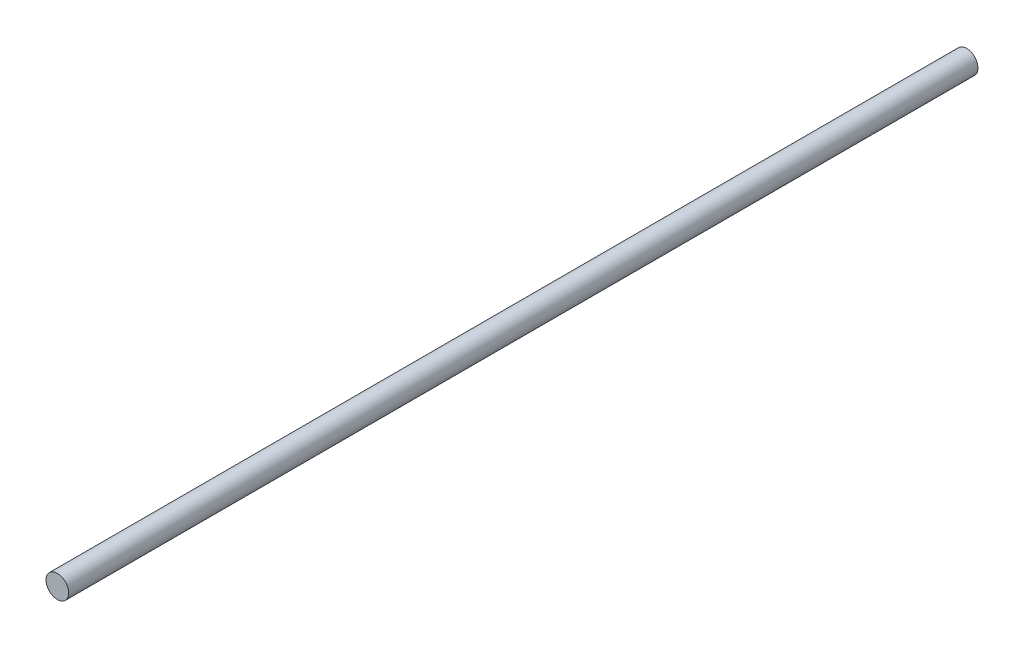
ISO-10303-21;
HEADER;
FILE_DESCRIPTION(('STEP AP214'),'2;1');
FILE_NAME('part.step','',(''),(''),'','','');
FILE_SCHEMA(('AUTOMOTIVE_DESIGN { 1 0 10303 214 1 1 1 1 }'));
ENDSEC;
DATA;
#1=APPLICATION_CONTEXT('core data for automotive mechanical design processes');
#2=APPLICATION_PROTOCOL_DEFINITION('international standard','automotive_design',2000,#1);
#3=PRODUCT_CONTEXT('',#1,'mechanical');
#4=PRODUCT('Part','Part','',(#3));
#5=PRODUCT_RELATED_PRODUCT_CATEGORY('part','',(#4));
#6=PRODUCT_DEFINITION_FORMATION('','',#4);
#7=PRODUCT_DEFINITION_CONTEXT('part definition',#1,'design');
#8=PRODUCT_DEFINITION('design','',#6,#7);
#9=PRODUCT_DEFINITION_SHAPE('','',#8);
#10=(LENGTH_UNIT() NAMED_UNIT(*) SI_UNIT(.MILLI.,.METRE.));
#11=(NAMED_UNIT(*) PLANE_ANGLE_UNIT() SI_UNIT($,.RADIAN.));
#12=(NAMED_UNIT(*) SI_UNIT($,.STERADIAN.) SOLID_ANGLE_UNIT());
#13=UNCERTAINTY_MEASURE_WITH_UNIT(LENGTH_MEASURE(1.E-05),#10,'distance_accuracy_value','');
#14=(GEOMETRIC_REPRESENTATION_CONTEXT(3) GLOBAL_UNCERTAINTY_ASSIGNED_CONTEXT((#13)) GLOBAL_UNIT_ASSIGNED_CONTEXT((#10,
#11,#12)) REPRESENTATION_CONTEXT('',''));
#15=CARTESIAN_POINT('',(0.,0.,0.));
#16=DIRECTION('',(0.,0.,1.));
#17=DIRECTION('',(1.,0.,0.));
#18=AXIS2_PLACEMENT_3D('',#15,#16,#17);
#19=CARTESIAN_POINT('',(0.,0.,200.));
#20=DIRECTION('',(0.,0.,-1.));
#21=DIRECTION('',(-1.,0.,0.));
#22=AXIS2_PLACEMENT_3D('',#19,#20,#21);
#23=CYLINDRICAL_SURFACE('',#22,2.5);
#24=CARTESIAN_POINT('',(0.,0.,200.));
#25=DIRECTION('',(0.,0.,1.));
#26=DIRECTION('',(1.,0.,0.));
#27=AXIS2_PLACEMENT_3D('',#24,#25,#26);
#28=CIRCLE('',#27,2.5);
#29=CARTESIAN_POINT('',(2.5,0.,200.));
#30=VERTEX_POINT('',#29);
#31=EDGE_CURVE('E10',#30,#30,#28,.T.);
#32=ORIENTED_EDGE('',*,*,#31,.F.);
#33=EDGE_LOOP('',(#32));
#34=FACE_BOUND('',#33,.T.);
#35=CARTESIAN_POINT('',(0.,0.,0.));
#36=DIRECTION('',(0.,0.,1.));
#37=DIRECTION('',(1.,0.,0.));
#38=AXIS2_PLACEMENT_3D('',#35,#36,#37);
#39=CIRCLE('',#38,2.5);
#40=CARTESIAN_POINT('',(2.5,0.,0.));
#41=VERTEX_POINT('',#40);
#42=EDGE_CURVE('E35',#41,#41,#39,.T.);
#43=ORIENTED_EDGE('',*,*,#42,.T.);
#44=EDGE_LOOP('',(#43));
#45=FACE_BOUND('',#44,.T.);
#46=ADVANCED_FACE('F32',(#34,#45),#23,.T.);
#47=CARTESIAN_POINT('',(0.,0.,200.));
#48=DIRECTION('',(0.,0.,1.));
#49=DIRECTION('',(1.,0.,0.));
#50=AXIS2_PLACEMENT_3D('',#47,#48,#49);
#51=PLANE('',#50);
#52=ORIENTED_EDGE('',*,*,#31,.T.);
#53=EDGE_LOOP('',(#52));
#54=FACE_BOUND('',#53,.T.);
#55=ADVANCED_FACE('F47',(#54),#51,.T.);
#56=CARTESIAN_POINT('',(0.,0.,0.));
#57=DIRECTION('',(0.,0.,1.));
#58=DIRECTION('',(1.,0.,0.));
#59=AXIS2_PLACEMENT_3D('',#56,#57,#58);
#60=PLANE('',#59);
#61=ORIENTED_EDGE('',*,*,#42,.F.);
#62=EDGE_LOOP('',(#61));
#63=FACE_BOUND('',#62,.T.);
#64=ADVANCED_FACE('F45',(#63),#60,.F.);
#65=CLOSED_SHELL('',(#46,#55,#64));
#66=MANIFOLD_SOLID_BREP('B2',#65);
#67=ADVANCED_BREP_SHAPE_REPRESENTATION('',(#18,#66),#14);
#68=SHAPE_DEFINITION_REPRESENTATION(#9,#67);
ENDSEC;
END-ISO-10303-21;
